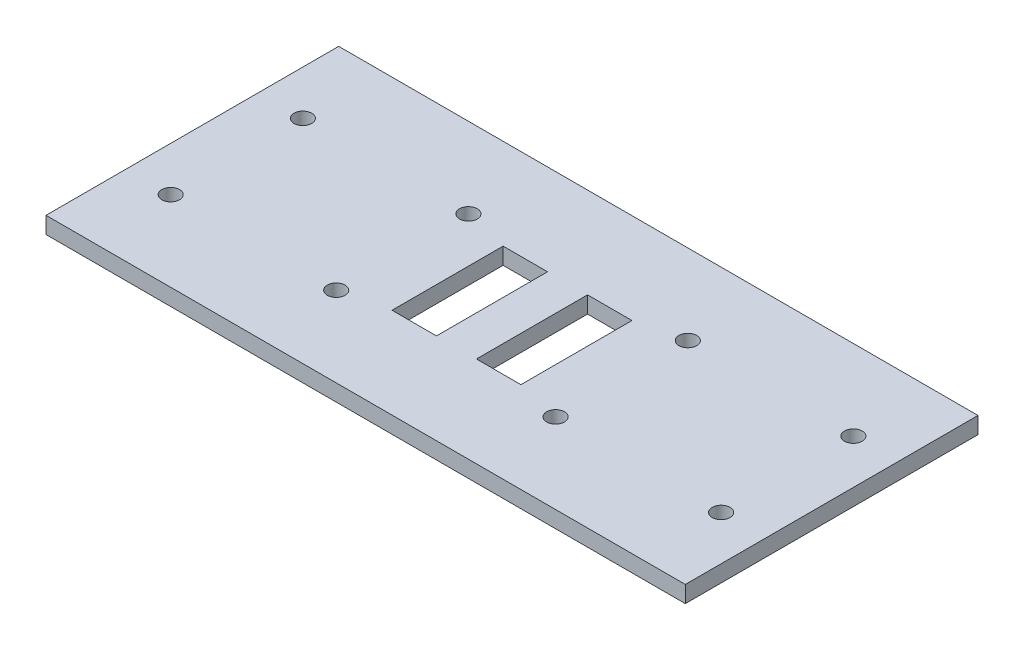
ISO-10303-21;
HEADER;
FILE_DESCRIPTION(('STEP AP214'),'2;1');
FILE_NAME('part.step','',(''),(''),'','','');
FILE_SCHEMA(('AUTOMOTIVE_DESIGN { 1 0 10303 214 1 1 1 1 }'));
ENDSEC;
DATA;
#1=APPLICATION_CONTEXT('core data for automotive mechanical design processes');
#2=APPLICATION_PROTOCOL_DEFINITION('international standard','automotive_design',2000,#1);
#3=PRODUCT_CONTEXT('',#1,'mechanical');
#4=PRODUCT('Part','Part','',(#3));
#5=PRODUCT_RELATED_PRODUCT_CATEGORY('part','',(#4));
#6=PRODUCT_DEFINITION_FORMATION('','',#4);
#7=PRODUCT_DEFINITION_CONTEXT('part definition',#1,'design');
#8=PRODUCT_DEFINITION('design','',#6,#7);
#9=PRODUCT_DEFINITION_SHAPE('','',#8);
#10=(LENGTH_UNIT() NAMED_UNIT(*) SI_UNIT(.MILLI.,.METRE.));
#11=(NAMED_UNIT(*) PLANE_ANGLE_UNIT() SI_UNIT($,.RADIAN.));
#12=(NAMED_UNIT(*) SI_UNIT($,.STERADIAN.) SOLID_ANGLE_UNIT());
#13=UNCERTAINTY_MEASURE_WITH_UNIT(LENGTH_MEASURE(1.E-05),#10,'distance_accuracy_value','');
#14=(GEOMETRIC_REPRESENTATION_CONTEXT(3) GLOBAL_UNCERTAINTY_ASSIGNED_CONTEXT((#13)) GLOBAL_UNIT_ASSIGNED_CONTEXT((#10,
#11,#12)) REPRESENTATION_CONTEXT('',''));
#15=CARTESIAN_POINT('',(0.,0.,0.));
#16=DIRECTION('',(0.,0.,1.));
#17=DIRECTION('',(1.,0.,0.));
#18=AXIS2_PLACEMENT_3D('',#15,#16,#17);
#19=CARTESIAN_POINT('',(-57.5483884452991,3.,26.3463557030392));
#20=DIRECTION('',(1.,0.,0.));
#21=DIRECTION('',(0.,0.,-1.));
#22=AXIS2_PLACEMENT_3D('',#19,#20,#21);
#23=PLANE('',#22);
#24=DIRECTION('',(0.,0.,1.));
#25=VECTOR('',#24,1.);
#26=CARTESIAN_POINT('',(-57.5483884452991,0.,26.3463557030392));
#27=LINE('',#26,#25);
#28=CARTESIAN_POINT('',(-57.5483884452991,0.,-26.3463557030392));
#29=VERTEX_POINT('',#28);
#30=CARTESIAN_POINT('',(-57.5483884452991,0.,26.3463557030392));
#31=VERTEX_POINT('',#30);
#32=EDGE_CURVE('E282',#29,#31,#27,.T.);
#33=ORIENTED_EDGE('',*,*,#32,.T.);
#34=DIRECTION('',(0.,-1.,0.));
#35=VECTOR('',#34,1.);
#36=CARTESIAN_POINT('',(-57.5483884452991,3.,26.3463557030392));
#37=LINE('',#36,#35);
#38=CARTESIAN_POINT('',(-57.5483884452991,3.,26.3463557030392));
#39=VERTEX_POINT('',#38);
#40=EDGE_CURVE('E11',#39,#31,#37,.T.);
#41=ORIENTED_EDGE('',*,*,#40,.F.);
#42=DIRECTION('',(0.,0.,1.));
#43=VECTOR('',#42,1.);
#44=CARTESIAN_POINT('',(-57.5483884452991,3.,26.3463557030392));
#45=LINE('',#44,#43);
#46=CARTESIAN_POINT('',(-57.5483884452991,3.,-26.3463557030392));
#47=VERTEX_POINT('',#46);
#48=EDGE_CURVE('E286',#47,#39,#45,.T.);
#49=ORIENTED_EDGE('',*,*,#48,.F.);
#50=DIRECTION('',(0.,-1.,0.));
#51=VECTOR('',#50,1.);
#52=CARTESIAN_POINT('',(-57.5483884452991,3.,-26.3463557030392));
#53=LINE('',#52,#51);
#54=EDGE_CURVE('E300',#47,#29,#53,.T.);
#55=ORIENTED_EDGE('',*,*,#54,.T.);
#56=EDGE_LOOP('',(#33,#41,#49,#55));
#57=FACE_BOUND('',#56,.T.);
#58=ADVANCED_FACE('F39',(#57),#23,.F.);
#59=CARTESIAN_POINT('',(57.5483884452991,3.,26.3463557030392));
#60=DIRECTION('',(0.,0.,-1.));
#61=DIRECTION('',(-1.,0.,0.));
#62=AXIS2_PLACEMENT_3D('',#59,#60,#61);
#63=PLANE('',#62);
#64=DIRECTION('',(1.,0.,0.));
#65=VECTOR('',#64,1.);
#66=CARTESIAN_POINT('',(57.5483884452991,0.,26.3463557030392));
#67=LINE('',#66,#65);
#68=CARTESIAN_POINT('',(57.5483884452991,0.,26.3463557030392));
#69=VERTEX_POINT('',#68);
#70=EDGE_CURVE('E304',#31,#69,#67,.T.);
#71=ORIENTED_EDGE('',*,*,#70,.T.);
#72=DIRECTION('',(0.,-1.,0.));
#73=VECTOR('',#72,1.);
#74=CARTESIAN_POINT('',(57.5483884452991,3.,26.3463557030392));
#75=LINE('',#74,#73);
#76=CARTESIAN_POINT('',(57.5483884452991,3.,26.3463557030392));
#77=VERTEX_POINT('',#76);
#78=EDGE_CURVE('E47',#77,#69,#75,.T.);
#79=ORIENTED_EDGE('',*,*,#78,.F.);
#80=DIRECTION('',(1.,0.,0.));
#81=VECTOR('',#80,1.);
#82=CARTESIAN_POINT('',(57.5483884452991,3.,26.3463557030392));
#83=LINE('',#82,#81);
#84=EDGE_CURVE('E290',#39,#77,#83,.T.);
#85=ORIENTED_EDGE('',*,*,#84,.F.);
#86=ORIENTED_EDGE('',*,*,#40,.T.);
#87=EDGE_LOOP('',(#71,#79,#85,#86));
#88=FACE_BOUND('',#87,.T.);
#89=ADVANCED_FACE('F339',(#88),#63,.F.);
#90=CARTESIAN_POINT('',(57.5483884452991,3.,-26.3463557030392));
#91=DIRECTION('',(-1.,0.,0.));
#92=DIRECTION('',(0.,0.,1.));
#93=AXIS2_PLACEMENT_3D('',#90,#91,#92);
#94=PLANE('',#93);
#95=DIRECTION('',(0.,0.,-1.));
#96=VECTOR('',#95,1.);
#97=CARTESIAN_POINT('',(57.5483884452991,0.,-26.3463557030392));
#98=LINE('',#97,#96);
#99=CARTESIAN_POINT('',(57.5483884452991,0.,-26.3463557030392));
#100=VERTEX_POINT('',#99);
#101=EDGE_CURVE('E307',#69,#100,#98,.T.);
#102=ORIENTED_EDGE('',*,*,#101,.T.);
#103=DIRECTION('',(0.,-1.,0.));
#104=VECTOR('',#103,1.);
#105=CARTESIAN_POINT('',(57.5483884452991,3.,-26.3463557030392));
#106=LINE('',#105,#104);
#107=CARTESIAN_POINT('',(57.5483884452991,3.,-26.3463557030392));
#108=VERTEX_POINT('',#107);
#109=EDGE_CURVE('E315',#108,#100,#106,.T.);
#110=ORIENTED_EDGE('',*,*,#109,.F.);
#111=DIRECTION('',(0.,0.,-1.));
#112=VECTOR('',#111,1.);
#113=CARTESIAN_POINT('',(57.5483884452991,3.,-26.3463557030392));
#114=LINE('',#113,#112);
#115=EDGE_CURVE('E294',#77,#108,#114,.T.);
#116=ORIENTED_EDGE('',*,*,#115,.F.);
#117=ORIENTED_EDGE('',*,*,#78,.T.);
#118=EDGE_LOOP('',(#102,#110,#116,#117));
#119=FACE_BOUND('',#118,.T.);
#120=ADVANCED_FACE('F324',(#119),#94,.F.);
#121=CARTESIAN_POINT('',(-57.5483884452991,3.,-26.3463557030392));
#122=DIRECTION('',(0.,0.,1.));
#123=DIRECTION('',(1.,0.,0.));
#124=AXIS2_PLACEMENT_3D('',#121,#122,#123);
#125=PLANE('',#124);
#126=DIRECTION('',(-1.,0.,0.));
#127=VECTOR('',#126,1.);
#128=CARTESIAN_POINT('',(-57.5483884452991,0.,-26.3463557030392));
#129=LINE('',#128,#127);
#130=EDGE_CURVE('E291',#100,#29,#129,.T.);
#131=ORIENTED_EDGE('',*,*,#130,.T.);
#132=ORIENTED_EDGE('',*,*,#54,.F.);
#133=DIRECTION('',(-1.,0.,0.));
#134=VECTOR('',#133,1.);
#135=CARTESIAN_POINT('',(-57.5483884452991,3.,-26.3463557030392));
#136=LINE('',#135,#134);
#137=EDGE_CURVE('E297',#108,#47,#136,.T.);
#138=ORIENTED_EDGE('',*,*,#137,.F.);
#139=ORIENTED_EDGE('',*,*,#109,.T.);
#140=EDGE_LOOP('',(#131,#132,#138,#139));
#141=FACE_BOUND('',#140,.T.);
#142=ADVANCED_FACE('F332',(#141),#125,.F.);
#143=CARTESIAN_POINT('',(0.,3.,0.));
#144=DIRECTION('',(0.,-1.,0.));
#145=DIRECTION('',(0.,0.,-1.));
#146=AXIS2_PLACEMENT_3D('',#143,#144,#145);
#147=PLANE('',#146);
#148=DIRECTION('',(1.,0.,0.));
#149=VECTOR('',#148,1.);
#150=CARTESIAN_POINT('',(-3.59838844529941,3.,9.9999999999997));
#151=LINE('',#150,#149);
#152=CARTESIAN_POINT('',(-11.5983884452994,3.,9.99999999999971));
#153=VERTEX_POINT('',#152);
#154=CARTESIAN_POINT('',(-3.59838844529941,3.,9.9999999999997));
#155=VERTEX_POINT('',#154);
#156=EDGE_CURVE('E165',#153,#155,#151,.T.);
#157=ORIENTED_EDGE('',*,*,#156,.F.);
#158=DIRECTION('',(0.,0.,1.));
#159=VECTOR('',#158,1.);
#160=CARTESIAN_POINT('',(-11.5983884452994,3.,9.99999999999971));
#161=LINE('',#160,#159);
#162=CARTESIAN_POINT('',(-11.5983884452994,3.,-10.0000000000003));
#163=VERTEX_POINT('',#162);
#164=EDGE_CURVE('E54',#163,#153,#161,.T.);
#165=ORIENTED_EDGE('',*,*,#164,.F.);
#166=DIRECTION('',(-1.,0.,0.));
#167=VECTOR('',#166,1.);
#168=CARTESIAN_POINT('',(-11.5983884452994,3.,-10.0000000000003));
#169=LINE('',#168,#167);
#170=CARTESIAN_POINT('',(-3.59838844529941,3.,-10.0000000000003));
#171=VERTEX_POINT('',#170);
#172=EDGE_CURVE('E152',#171,#163,#169,.T.);
#173=ORIENTED_EDGE('',*,*,#172,.F.);
#174=DIRECTION('',(0.,0.,-1.));
#175=VECTOR('',#174,1.);
#176=CARTESIAN_POINT('',(-3.59838844529941,3.,-10.0000000000003));
#177=LINE('',#176,#175);
#178=EDGE_CURVE('E156',#155,#171,#177,.T.);
#179=ORIENTED_EDGE('',*,*,#178,.F.);
#180=EDGE_LOOP('',(#157,#165,#173,#179));
#181=FACE_BOUND('',#180,.T.);
#182=DIRECTION('',(1.,0.,0.));
#183=VECTOR('',#182,1.);
#184=CARTESIAN_POINT('',(3.59838844529941,3.,9.9999999999997));
#185=LINE('',#184,#183);
#186=CARTESIAN_POINT('',(3.59838844529941,3.,9.9999999999997));
#187=VERTEX_POINT('',#186);
#188=CARTESIAN_POINT('',(11.5983884452994,3.,9.9999999999997));
#189=VERTEX_POINT('',#188);
#190=EDGE_CURVE('E201',#187,#189,#185,.T.);
#191=ORIENTED_EDGE('',*,*,#190,.F.);
#192=DIRECTION('',(0.,0.,1.));
#193=VECTOR('',#192,1.);
#194=CARTESIAN_POINT('',(3.5983884452994,3.,-10.0000000000003));
#195=LINE('',#194,#193);
#196=CARTESIAN_POINT('',(3.5983884452994,3.,-10.0000000000003));
#197=VERTEX_POINT('',#196);
#198=EDGE_CURVE('E62',#197,#187,#195,.T.);
#199=ORIENTED_EDGE('',*,*,#198,.F.);
#200=DIRECTION('',(-1.,0.,0.));
#201=VECTOR('',#200,1.);
#202=CARTESIAN_POINT('',(11.5983884452994,3.,-10.0000000000003));
#203=LINE('',#202,#201);
#204=CARTESIAN_POINT('',(11.5983884452994,3.,-10.0000000000003));
#205=VERTEX_POINT('',#204);
#206=EDGE_CURVE('E186',#205,#197,#203,.T.);
#207=ORIENTED_EDGE('',*,*,#206,.F.);
#208=DIRECTION('',(0.,0.,-1.));
#209=VECTOR('',#208,1.);
#210=CARTESIAN_POINT('',(11.5983884452994,3.,9.9999999999997));
#211=LINE('',#210,#209);
#212=EDGE_CURVE('E205',#189,#205,#211,.T.);
#213=ORIENTED_EDGE('',*,*,#212,.F.);
#214=EDGE_LOOP('',(#191,#199,#207,#213));
#215=FACE_BOUND('',#214,.T.);
#216=CARTESIAN_POINT('',(49.5483884452993,3.,11.8999999999995));
#217=DIRECTION('',(0.,1.,0.));
#218=DIRECTION('',(0.,0.,-1.));
#219=AXIS2_PLACEMENT_3D('',#216,#217,#218);
#220=CIRCLE('',#219,1.6);
#221=CARTESIAN_POINT('',(49.5483884452993,3.,10.2999999999995));
#222=VERTEX_POINT('',#221);
#223=EDGE_CURVE('E226',#222,#222,#220,.T.);
#224=ORIENTED_EDGE('',*,*,#223,.F.);
#225=EDGE_LOOP('',(#224));
#226=FACE_BOUND('',#225,.T.);
#227=CARTESIAN_POINT('',(-19.7483884452993,3.,11.8999999999998));
#228=DIRECTION('',(0.,1.,0.));
#229=DIRECTION('',(0.,0.,1.));
#230=AXIS2_PLACEMENT_3D('',#227,#228,#229);
#231=CIRCLE('',#230,1.6);
#232=CARTESIAN_POINT('',(-19.7483884452993,3.,13.4999999999998));
#233=VERTEX_POINT('',#232);
#234=EDGE_CURVE('E251',#233,#233,#231,.T.);
#235=ORIENTED_EDGE('',*,*,#234,.F.);
#236=EDGE_LOOP('',(#235));
#237=FACE_BOUND('',#236,.T.);
#238=CARTESIAN_POINT('',(-49.5483884452993,3.,11.8999999999995));
#239=DIRECTION('',(0.,1.,0.));
#240=DIRECTION('',(0.,0.,1.));
#241=AXIS2_PLACEMENT_3D('',#238,#239,#240);
#242=CIRCLE('',#241,1.6);
#243=CARTESIAN_POINT('',(-49.5483884452993,3.,13.4999999999995));
#244=VERTEX_POINT('',#243);
#245=EDGE_CURVE('E250',#244,#244,#242,.T.);
#246=ORIENTED_EDGE('',*,*,#245,.F.);
#247=EDGE_LOOP('',(#246));
#248=FACE_BOUND('',#247,.T.);
#249=CARTESIAN_POINT('',(-19.748388445299,3.,-11.9000000000002));
#250=DIRECTION('',(0.,1.,0.));
#251=DIRECTION('',(0.,0.,1.));
#252=AXIS2_PLACEMENT_3D('',#249,#250,#251);
#253=CIRCLE('',#252,1.6);
#254=CARTESIAN_POINT('',(-19.748388445299,3.,-10.3000000000002));
#255=VERTEX_POINT('',#254);
#256=EDGE_CURVE('E267',#255,#255,#253,.T.);
#257=ORIENTED_EDGE('',*,*,#256,.F.);
#258=EDGE_LOOP('',(#257));
#259=FACE_BOUND('',#258,.T.);
#260=CARTESIAN_POINT('',(19.7483884452993,3.,11.8999999999998));
#261=DIRECTION('',(0.,1.,0.));
#262=DIRECTION('',(0.,0.,-1.));
#263=AXIS2_PLACEMENT_3D('',#260,#261,#262);
#264=CIRCLE('',#263,1.6);
#265=CARTESIAN_POINT('',(19.7483884452993,3.,10.2999999999998));
#266=VERTEX_POINT('',#265);
#267=EDGE_CURVE('E227',#266,#266,#264,.T.);
#268=ORIENTED_EDGE('',*,*,#267,.F.);
#269=EDGE_LOOP('',(#268));
#270=FACE_BOUND('',#269,.T.);
#271=CARTESIAN_POINT('',(19.748388445299,3.,-11.9000000000002));
#272=DIRECTION('',(0.,1.,0.));
#273=DIRECTION('',(0.,0.,-1.));
#274=AXIS2_PLACEMENT_3D('',#271,#272,#273);
#275=CIRCLE('',#274,1.6);
#276=CARTESIAN_POINT('',(19.748388445299,3.,-13.5000000000002));
#277=VERTEX_POINT('',#276);
#278=EDGE_CURVE('E235',#277,#277,#275,.T.);
#279=ORIENTED_EDGE('',*,*,#278,.F.);
#280=EDGE_LOOP('',(#279));
#281=FACE_BOUND('',#280,.T.);
#282=CARTESIAN_POINT('',(49.548388445299,3.,-11.9000000000005));
#283=DIRECTION('',(0.,1.,0.));
#284=DIRECTION('',(0.,0.,-1.));
#285=AXIS2_PLACEMENT_3D('',#282,#283,#284);
#286=CIRCLE('',#285,1.6);
#287=CARTESIAN_POINT('',(49.548388445299,3.,-13.5000000000005));
#288=VERTEX_POINT('',#287);
#289=EDGE_CURVE('E175',#288,#288,#286,.T.);
#290=ORIENTED_EDGE('',*,*,#289,.F.);
#291=EDGE_LOOP('',(#290));
#292=FACE_BOUND('',#291,.T.);
#293=CARTESIAN_POINT('',(-49.548388445299,3.,-11.9000000000005));
#294=DIRECTION('',(0.,1.,0.));
#295=DIRECTION('',(0.,0.,1.));
#296=AXIS2_PLACEMENT_3D('',#293,#294,#295);
#297=CIRCLE('',#296,1.6);
#298=CARTESIAN_POINT('',(-49.548388445299,3.,-10.3000000000005));
#299=VERTEX_POINT('',#298);
#300=EDGE_CURVE('E266',#299,#299,#297,.T.);
#301=ORIENTED_EDGE('',*,*,#300,.F.);
#302=EDGE_LOOP('',(#301));
#303=FACE_BOUND('',#302,.T.);
#304=ORIENTED_EDGE('',*,*,#48,.T.);
#305=ORIENTED_EDGE('',*,*,#84,.T.);
#306=ORIENTED_EDGE('',*,*,#115,.T.);
#307=ORIENTED_EDGE('',*,*,#137,.T.);
#308=EDGE_LOOP('',(#304,#305,#306,#307));
#309=FACE_BOUND('',#308,.T.);
#310=ADVANCED_FACE('F338',(#181,#215,#226,#237,#248,#259,#270,#281,#292,#303,#309),#147,.F.);
#311=CARTESIAN_POINT('',(0.,0.,0.));
#312=DIRECTION('',(0.,-1.,0.));
#313=DIRECTION('',(0.,0.,-1.));
#314=AXIS2_PLACEMENT_3D('',#311,#312,#313);
#315=PLANE('',#314);
#316=DIRECTION('',(0.,0.,1.));
#317=VECTOR('',#316,1.);
#318=CARTESIAN_POINT('',(-11.5983884452994,0.,9.99999999999971));
#319=LINE('',#318,#317);
#320=CARTESIAN_POINT('',(-11.5983884452994,0.,-10.0000000000003));
#321=VERTEX_POINT('',#320);
#322=CARTESIAN_POINT('',(-11.5983884452994,0.,9.99999999999971));
#323=VERTEX_POINT('',#322);
#324=EDGE_CURVE('E130',#321,#323,#319,.T.);
#325=ORIENTED_EDGE('',*,*,#324,.T.);
#326=DIRECTION('',(1.,0.,0.));
#327=VECTOR('',#326,1.);
#328=CARTESIAN_POINT('',(-3.59838844529941,0.,9.9999999999997));
#329=LINE('',#328,#327);
#330=CARTESIAN_POINT('',(-3.59838844529941,0.,9.9999999999997));
#331=VERTEX_POINT('',#330);
#332=EDGE_CURVE('E141',#323,#331,#329,.T.);
#333=ORIENTED_EDGE('',*,*,#332,.T.);
#334=DIRECTION('',(0.,0.,-1.));
#335=VECTOR('',#334,1.);
#336=CARTESIAN_POINT('',(-3.59838844529941,0.,-10.0000000000003));
#337=LINE('',#336,#335);
#338=CARTESIAN_POINT('',(-3.59838844529941,0.,-10.0000000000003));
#339=VERTEX_POINT('',#338);
#340=EDGE_CURVE('E146',#331,#339,#337,.T.);
#341=ORIENTED_EDGE('',*,*,#340,.T.);
#342=DIRECTION('',(-1.,0.,0.));
#343=VECTOR('',#342,1.);
#344=CARTESIAN_POINT('',(-11.5983884452994,0.,-10.0000000000003));
#345=LINE('',#344,#343);
#346=EDGE_CURVE('E137',#339,#321,#345,.T.);
#347=ORIENTED_EDGE('',*,*,#346,.T.);
#348=EDGE_LOOP('',(#325,#333,#341,#347));
#349=FACE_BOUND('',#348,.T.);
#350=DIRECTION('',(0.,0.,1.));
#351=VECTOR('',#350,1.);
#352=CARTESIAN_POINT('',(3.5983884452994,0.,-10.0000000000003));
#353=LINE('',#352,#351);
#354=CARTESIAN_POINT('',(3.5983884452994,0.,-10.0000000000003));
#355=VERTEX_POINT('',#354);
#356=CARTESIAN_POINT('',(3.59838844529941,0.,9.9999999999997));
#357=VERTEX_POINT('',#356);
#358=EDGE_CURVE('E181',#355,#357,#353,.T.);
#359=ORIENTED_EDGE('',*,*,#358,.T.);
#360=DIRECTION('',(1.,0.,0.));
#361=VECTOR('',#360,1.);
#362=CARTESIAN_POINT('',(3.59838844529941,0.,9.9999999999997));
#363=LINE('',#362,#361);
#364=CARTESIAN_POINT('',(11.5983884452994,0.,9.9999999999997));
#365=VERTEX_POINT('',#364);
#366=EDGE_CURVE('E185',#357,#365,#363,.T.);
#367=ORIENTED_EDGE('',*,*,#366,.T.);
#368=DIRECTION('',(0.,0.,-1.));
#369=VECTOR('',#368,1.);
#370=CARTESIAN_POINT('',(11.5983884452994,0.,9.9999999999997));
#371=LINE('',#370,#369);
#372=CARTESIAN_POINT('',(11.5983884452994,0.,-10.0000000000003));
#373=VERTEX_POINT('',#372);
#374=EDGE_CURVE('E190',#365,#373,#371,.T.);
#375=ORIENTED_EDGE('',*,*,#374,.T.);
#376=DIRECTION('',(-1.,0.,0.));
#377=VECTOR('',#376,1.);
#378=CARTESIAN_POINT('',(11.5983884452994,0.,-10.0000000000003));
#379=LINE('',#378,#377);
#380=EDGE_CURVE('E194',#373,#355,#379,.T.);
#381=ORIENTED_EDGE('',*,*,#380,.T.);
#382=EDGE_LOOP('',(#359,#367,#375,#381));
#383=FACE_BOUND('',#382,.T.);
#384=CARTESIAN_POINT('',(49.5483884452993,0.,11.8999999999995));
#385=DIRECTION('',(0.,1.,0.));
#386=DIRECTION('',(0.,0.,-1.));
#387=AXIS2_PLACEMENT_3D('',#384,#385,#386);
#388=CIRCLE('',#387,1.6);
#389=CARTESIAN_POINT('',(49.5483884452993,0.,10.2999999999995));
#390=VERTEX_POINT('',#389);
#391=EDGE_CURVE('E255',#390,#390,#388,.T.);
#392=ORIENTED_EDGE('',*,*,#391,.T.);
#393=EDGE_LOOP('',(#392));
#394=FACE_BOUND('',#393,.T.);
#395=CARTESIAN_POINT('',(-19.7483884452993,0.,11.8999999999998));
#396=DIRECTION('',(0.,1.,0.));
#397=DIRECTION('',(0.,0.,1.));
#398=AXIS2_PLACEMENT_3D('',#395,#396,#397);
#399=CIRCLE('',#398,1.6);
#400=CARTESIAN_POINT('',(-19.7483884452993,0.,13.4999999999998));
#401=VERTEX_POINT('',#400);
#402=EDGE_CURVE('E246',#401,#401,#399,.T.);
#403=ORIENTED_EDGE('',*,*,#402,.T.);
#404=EDGE_LOOP('',(#403));
#405=FACE_BOUND('',#404,.T.);
#406=CARTESIAN_POINT('',(-49.5483884452993,0.,11.8999999999995));
#407=DIRECTION('',(0.,1.,0.));
#408=DIRECTION('',(0.,0.,1.));
#409=AXIS2_PLACEMENT_3D('',#406,#407,#408);
#410=CIRCLE('',#409,1.6);
#411=CARTESIAN_POINT('',(-49.5483884452993,0.,13.4999999999995));
#412=VERTEX_POINT('',#411);
#413=EDGE_CURVE('E271',#412,#412,#410,.T.);
#414=ORIENTED_EDGE('',*,*,#413,.T.);
#415=EDGE_LOOP('',(#414));
#416=FACE_BOUND('',#415,.T.);
#417=CARTESIAN_POINT('',(-19.748388445299,0.,-11.9000000000002));
#418=DIRECTION('',(0.,1.,0.));
#419=DIRECTION('',(0.,0.,1.));
#420=AXIS2_PLACEMENT_3D('',#417,#418,#419);
#421=CIRCLE('',#420,1.6);
#422=CARTESIAN_POINT('',(-19.748388445299,0.,-10.3000000000002));
#423=VERTEX_POINT('',#422);
#424=EDGE_CURVE('E262',#423,#423,#421,.T.);
#425=ORIENTED_EDGE('',*,*,#424,.T.);
#426=EDGE_LOOP('',(#425));
#427=FACE_BOUND('',#426,.T.);
#428=CARTESIAN_POINT('',(19.7483884452993,0.,11.8999999999998));
#429=DIRECTION('',(0.,1.,0.));
#430=DIRECTION('',(0.,0.,-1.));
#431=AXIS2_PLACEMENT_3D('',#428,#429,#430);
#432=CIRCLE('',#431,1.6);
#433=CARTESIAN_POINT('',(19.7483884452993,0.,10.2999999999998));
#434=VERTEX_POINT('',#433);
#435=EDGE_CURVE('E222',#434,#434,#432,.T.);
#436=ORIENTED_EDGE('',*,*,#435,.T.);
#437=EDGE_LOOP('',(#436));
#438=FACE_BOUND('',#437,.T.);
#439=CARTESIAN_POINT('',(19.748388445299,0.,-11.9000000000002));
#440=DIRECTION('',(0.,1.,0.));
#441=DIRECTION('',(0.,0.,-1.));
#442=AXIS2_PLACEMENT_3D('',#439,#440,#441);
#443=CIRCLE('',#442,1.6);
#444=CARTESIAN_POINT('',(19.748388445299,0.,-13.5000000000002));
#445=VERTEX_POINT('',#444);
#446=EDGE_CURVE('E231',#445,#445,#443,.T.);
#447=ORIENTED_EDGE('',*,*,#446,.T.);
#448=EDGE_LOOP('',(#447));
#449=FACE_BOUND('',#448,.T.);
#450=CARTESIAN_POINT('',(49.548388445299,0.,-11.9000000000005));
#451=DIRECTION('',(0.,1.,0.));
#452=DIRECTION('',(0.,0.,-1.));
#453=AXIS2_PLACEMENT_3D('',#450,#451,#452);
#454=CIRCLE('',#453,1.6);
#455=CARTESIAN_POINT('',(49.548388445299,0.,-13.5000000000005));
#456=VERTEX_POINT('',#455);
#457=EDGE_CURVE('E239',#456,#456,#454,.T.);
#458=ORIENTED_EDGE('',*,*,#457,.T.);
#459=EDGE_LOOP('',(#458));
#460=FACE_BOUND('',#459,.T.);
#461=CARTESIAN_POINT('',(-49.548388445299,0.,-11.9000000000005));
#462=DIRECTION('',(0.,1.,0.));
#463=DIRECTION('',(0.,0.,1.));
#464=AXIS2_PLACEMENT_3D('',#461,#462,#463);
#465=CIRCLE('',#464,1.6);
#466=CARTESIAN_POINT('',(-49.548388445299,0.,-10.3000000000005));
#467=VERTEX_POINT('',#466);
#468=EDGE_CURVE('E278',#467,#467,#465,.T.);
#469=ORIENTED_EDGE('',*,*,#468,.T.);
#470=EDGE_LOOP('',(#469));
#471=FACE_BOUND('',#470,.T.);
#472=ORIENTED_EDGE('',*,*,#32,.F.);
#473=ORIENTED_EDGE('',*,*,#130,.F.);
#474=ORIENTED_EDGE('',*,*,#101,.F.);
#475=ORIENTED_EDGE('',*,*,#70,.F.);
#476=EDGE_LOOP('',(#472,#473,#474,#475));
#477=FACE_BOUND('',#476,.T.);
#478=ADVANCED_FACE('F148',(#349,#383,#394,#405,#416,#427,#438,#449,#460,#471,#477),#315,.T.);
#479=CARTESIAN_POINT('',(-49.548388445299,0.,-11.9000000000005));
#480=DIRECTION('',(0.,1.,0.));
#481=DIRECTION('',(0.,0.,1.));
#482=AXIS2_PLACEMENT_3D('',#479,#480,#481);
#483=CYLINDRICAL_SURFACE('',#482,1.6);
#484=ORIENTED_EDGE('',*,*,#468,.F.);
#485=EDGE_LOOP('',(#484));
#486=FACE_BOUND('',#485,.T.);
#487=ORIENTED_EDGE('',*,*,#300,.T.);
#488=EDGE_LOOP('',(#487));
#489=FACE_BOUND('',#488,.T.);
#490=ADVANCED_FACE('F351',(#486,#489),#483,.F.);
#491=CARTESIAN_POINT('',(49.548388445299,0.,-11.9000000000005));
#492=DIRECTION('',(0.,1.,0.));
#493=DIRECTION('',(0.,0.,1.));
#494=AXIS2_PLACEMENT_3D('',#491,#492,#493);
#495=CYLINDRICAL_SURFACE('',#494,1.6);
#496=ORIENTED_EDGE('',*,*,#457,.F.);
#497=EDGE_LOOP('',(#496));
#498=FACE_BOUND('',#497,.T.);
#499=ORIENTED_EDGE('',*,*,#289,.T.);
#500=EDGE_LOOP('',(#499));
#501=FACE_BOUND('',#500,.T.);
#502=ADVANCED_FACE('F357',(#498,#501),#495,.F.);
#503=CARTESIAN_POINT('',(19.748388445299,0.,-11.9000000000002));
#504=DIRECTION('',(0.,1.,0.));
#505=DIRECTION('',(0.,0.,1.));
#506=AXIS2_PLACEMENT_3D('',#503,#504,#505);
#507=CYLINDRICAL_SURFACE('',#506,1.6);
#508=ORIENTED_EDGE('',*,*,#446,.F.);
#509=EDGE_LOOP('',(#508));
#510=FACE_BOUND('',#509,.T.);
#511=ORIENTED_EDGE('',*,*,#278,.T.);
#512=EDGE_LOOP('',(#511));
#513=FACE_BOUND('',#512,.T.);
#514=ADVANCED_FACE('F379',(#510,#513),#507,.F.);
#515=CARTESIAN_POINT('',(19.7483884452993,0.,11.8999999999998));
#516=DIRECTION('',(0.,1.,0.));
#517=DIRECTION('',(0.,0.,1.));
#518=AXIS2_PLACEMENT_3D('',#515,#516,#517);
#519=CYLINDRICAL_SURFACE('',#518,1.6);
#520=ORIENTED_EDGE('',*,*,#435,.F.);
#521=EDGE_LOOP('',(#520));
#522=FACE_BOUND('',#521,.T.);
#523=ORIENTED_EDGE('',*,*,#267,.T.);
#524=EDGE_LOOP('',(#523));
#525=FACE_BOUND('',#524,.T.);
#526=ADVANCED_FACE('F367',(#522,#525),#519,.F.);
#527=CARTESIAN_POINT('',(-19.748388445299,0.,-11.9000000000002));
#528=DIRECTION('',(0.,1.,0.));
#529=DIRECTION('',(0.,0.,1.));
#530=AXIS2_PLACEMENT_3D('',#527,#528,#529);
#531=CYLINDRICAL_SURFACE('',#530,1.6);
#532=ORIENTED_EDGE('',*,*,#424,.F.);
#533=EDGE_LOOP('',(#532));
#534=FACE_BOUND('',#533,.T.);
#535=ORIENTED_EDGE('',*,*,#256,.T.);
#536=EDGE_LOOP('',(#535));
#537=FACE_BOUND('',#536,.T.);
#538=ADVANCED_FACE('F363',(#534,#537),#531,.F.);
#539=CARTESIAN_POINT('',(-49.5483884452993,0.,11.8999999999995));
#540=DIRECTION('',(0.,1.,0.));
#541=DIRECTION('',(0.,0.,1.));
#542=AXIS2_PLACEMENT_3D('',#539,#540,#541);
#543=CYLINDRICAL_SURFACE('',#542,1.6);
#544=ORIENTED_EDGE('',*,*,#413,.F.);
#545=EDGE_LOOP('',(#544));
#546=FACE_BOUND('',#545,.T.);
#547=ORIENTED_EDGE('',*,*,#245,.T.);
#548=EDGE_LOOP('',(#547));
#549=FACE_BOUND('',#548,.T.);
#550=ADVANCED_FACE('F359',(#546,#549),#543,.F.);
#551=CARTESIAN_POINT('',(-19.7483884452993,0.,11.8999999999998));
#552=DIRECTION('',(0.,1.,0.));
#553=DIRECTION('',(0.,0.,1.));
#554=AXIS2_PLACEMENT_3D('',#551,#552,#553);
#555=CYLINDRICAL_SURFACE('',#554,1.6);
#556=ORIENTED_EDGE('',*,*,#402,.F.);
#557=EDGE_LOOP('',(#556));
#558=FACE_BOUND('',#557,.T.);
#559=ORIENTED_EDGE('',*,*,#234,.T.);
#560=EDGE_LOOP('',(#559));
#561=FACE_BOUND('',#560,.T.);
#562=ADVANCED_FACE('F362',(#558,#561),#555,.F.);
#563=CARTESIAN_POINT('',(49.5483884452993,0.,11.8999999999995));
#564=DIRECTION('',(0.,1.,0.));
#565=DIRECTION('',(0.,0.,1.));
#566=AXIS2_PLACEMENT_3D('',#563,#564,#565);
#567=CYLINDRICAL_SURFACE('',#566,1.6);
#568=ORIENTED_EDGE('',*,*,#391,.F.);
#569=EDGE_LOOP('',(#568));
#570=FACE_BOUND('',#569,.T.);
#571=ORIENTED_EDGE('',*,*,#223,.T.);
#572=EDGE_LOOP('',(#571));
#573=FACE_BOUND('',#572,.T.);
#574=ADVANCED_FACE('F369',(#570,#573),#567,.F.);
#575=CARTESIAN_POINT('',(3.5983884452994,0.,-10.0000000000003));
#576=DIRECTION('',(-1.,0.,0.));
#577=DIRECTION('',(0.,0.,1.));
#578=AXIS2_PLACEMENT_3D('',#575,#576,#577);
#579=PLANE('',#578);
#580=ORIENTED_EDGE('',*,*,#198,.T.);
#581=DIRECTION('',(0.,1.,0.));
#582=VECTOR('',#581,1.);
#583=CARTESIAN_POINT('',(3.59838844529941,0.,9.9999999999997));
#584=LINE('',#583,#582);
#585=EDGE_CURVE('E198',#357,#187,#584,.T.);
#586=ORIENTED_EDGE('',*,*,#585,.F.);
#587=ORIENTED_EDGE('',*,*,#358,.F.);
#588=DIRECTION('',(0.,1.,0.));
#589=VECTOR('',#588,1.);
#590=CARTESIAN_POINT('',(3.5983884452994,0.,-10.0000000000003));
#591=LINE('',#590,#589);
#592=EDGE_CURVE('E166',#355,#197,#591,.T.);
#593=ORIENTED_EDGE('',*,*,#592,.T.);
#594=EDGE_LOOP('',(#580,#586,#587,#593));
#595=FACE_BOUND('',#594,.T.);
#596=ADVANCED_FACE('F372',(#595),#579,.F.);
#597=CARTESIAN_POINT('',(11.5983884452994,0.,-10.0000000000003));
#598=DIRECTION('',(0.,0.,-1.));
#599=DIRECTION('',(-1.,0.,0.));
#600=AXIS2_PLACEMENT_3D('',#597,#598,#599);
#601=PLANE('',#600);
#602=ORIENTED_EDGE('',*,*,#206,.T.);
#603=ORIENTED_EDGE('',*,*,#592,.F.);
#604=ORIENTED_EDGE('',*,*,#380,.F.);
#605=DIRECTION('',(0.,1.,0.));
#606=VECTOR('',#605,1.);
#607=CARTESIAN_POINT('',(11.5983884452994,0.,-10.0000000000003));
#608=LINE('',#607,#606);
#609=EDGE_CURVE('E214',#373,#205,#608,.T.);
#610=ORIENTED_EDGE('',*,*,#609,.T.);
#611=EDGE_LOOP('',(#602,#603,#604,#610));
#612=FACE_BOUND('',#611,.T.);
#613=ADVANCED_FACE('F389',(#612),#601,.F.);
#614=CARTESIAN_POINT('',(11.5983884452994,0.,9.9999999999997));
#615=DIRECTION('',(1.,0.,0.));
#616=DIRECTION('',(0.,0.,-1.));
#617=AXIS2_PLACEMENT_3D('',#614,#615,#616);
#618=PLANE('',#617);
#619=ORIENTED_EDGE('',*,*,#212,.T.);
#620=ORIENTED_EDGE('',*,*,#609,.F.);
#621=ORIENTED_EDGE('',*,*,#374,.F.);
#622=DIRECTION('',(0.,1.,0.));
#623=VECTOR('',#622,1.);
#624=CARTESIAN_POINT('',(11.5983884452994,0.,9.9999999999997));
#625=LINE('',#624,#623);
#626=EDGE_CURVE('E217',#365,#189,#625,.T.);
#627=ORIENTED_EDGE('',*,*,#626,.T.);
#628=EDGE_LOOP('',(#619,#620,#621,#627));
#629=FACE_BOUND('',#628,.T.);
#630=ADVANCED_FACE('F393',(#629),#618,.F.);
#631=CARTESIAN_POINT('',(3.59838844529941,0.,9.9999999999997));
#632=DIRECTION('',(0.,0.,1.));
#633=DIRECTION('',(1.,0.,0.));
#634=AXIS2_PLACEMENT_3D('',#631,#632,#633);
#635=PLANE('',#634);
#636=ORIENTED_EDGE('',*,*,#190,.T.);
#637=ORIENTED_EDGE('',*,*,#626,.F.);
#638=ORIENTED_EDGE('',*,*,#366,.F.);
#639=ORIENTED_EDGE('',*,*,#585,.T.);
#640=EDGE_LOOP('',(#636,#637,#638,#639));
#641=FACE_BOUND('',#640,.T.);
#642=ADVANCED_FACE('F390',(#641),#635,.F.);
#643=CARTESIAN_POINT('',(-11.5983884452994,0.,9.99999999999971));
#644=DIRECTION('',(-1.,0.,0.));
#645=DIRECTION('',(0.,0.,1.));
#646=AXIS2_PLACEMENT_3D('',#643,#644,#645);
#647=PLANE('',#646);
#648=ORIENTED_EDGE('',*,*,#164,.T.);
#649=DIRECTION('',(0.,1.,0.));
#650=VECTOR('',#649,1.);
#651=CARTESIAN_POINT('',(-11.5983884452994,0.,9.99999999999971));
#652=LINE('',#651,#650);
#653=EDGE_CURVE('E126',#323,#153,#652,.T.);
#654=ORIENTED_EDGE('',*,*,#653,.F.);
#655=ORIENTED_EDGE('',*,*,#324,.F.);
#656=DIRECTION('',(0.,1.,0.));
#657=VECTOR('',#656,1.);
#658=CARTESIAN_POINT('',(-11.5983884452994,0.,-10.0000000000003));
#659=LINE('',#658,#657);
#660=EDGE_CURVE('E172',#321,#163,#659,.T.);
#661=ORIENTED_EDGE('',*,*,#660,.T.);
#662=EDGE_LOOP('',(#648,#654,#655,#661));
#663=FACE_BOUND('',#662,.T.);
#664=ADVANCED_FACE('F128',(#663),#647,.F.);
#665=CARTESIAN_POINT('',(-11.5983884452994,0.,-10.0000000000003));
#666=DIRECTION('',(0.,0.,-1.));
#667=DIRECTION('',(-1.,0.,0.));
#668=AXIS2_PLACEMENT_3D('',#665,#666,#667);
#669=PLANE('',#668);
#670=ORIENTED_EDGE('',*,*,#172,.T.);
#671=ORIENTED_EDGE('',*,*,#660,.F.);
#672=ORIENTED_EDGE('',*,*,#346,.F.);
#673=DIRECTION('',(0.,1.,0.));
#674=VECTOR('',#673,1.);
#675=CARTESIAN_POINT('',(-3.59838844529941,0.,-10.0000000000003));
#676=LINE('',#675,#674);
#677=EDGE_CURVE('E176',#339,#171,#676,.T.);
#678=ORIENTED_EDGE('',*,*,#677,.T.);
#679=EDGE_LOOP('',(#670,#671,#672,#678));
#680=FACE_BOUND('',#679,.T.);
#681=ADVANCED_FACE('F403',(#680),#669,.F.);
#682=CARTESIAN_POINT('',(-3.59838844529941,0.,-10.0000000000003));
#683=DIRECTION('',(1.,0.,0.));
#684=DIRECTION('',(0.,0.,-1.));
#685=AXIS2_PLACEMENT_3D('',#682,#683,#684);
#686=PLANE('',#685);
#687=ORIENTED_EDGE('',*,*,#178,.T.);
#688=ORIENTED_EDGE('',*,*,#677,.F.);
#689=ORIENTED_EDGE('',*,*,#340,.F.);
#690=DIRECTION('',(0.,1.,0.));
#691=VECTOR('',#690,1.);
#692=CARTESIAN_POINT('',(-3.59838844529941,0.,9.9999999999997));
#693=LINE('',#692,#691);
#694=EDGE_CURVE('E136',#331,#155,#693,.T.);
#695=ORIENTED_EDGE('',*,*,#694,.T.);
#696=EDGE_LOOP('',(#687,#688,#689,#695));
#697=FACE_BOUND('',#696,.T.);
#698=ADVANCED_FACE('F406',(#697),#686,.F.);
#699=CARTESIAN_POINT('',(-3.59838844529941,0.,9.9999999999997));
#700=DIRECTION('',(0.,0.,1.));
#701=DIRECTION('',(1.,0.,0.));
#702=AXIS2_PLACEMENT_3D('',#699,#700,#701);
#703=PLANE('',#702);
#704=ORIENTED_EDGE('',*,*,#156,.T.);
#705=ORIENTED_EDGE('',*,*,#694,.F.);
#706=ORIENTED_EDGE('',*,*,#332,.F.);
#707=ORIENTED_EDGE('',*,*,#653,.T.);
#708=EDGE_LOOP('',(#704,#705,#706,#707));
#709=FACE_BOUND('',#708,.T.);
#710=ADVANCED_FACE('F142',(#709),#703,.F.);
#711=CLOSED_SHELL('',(#58,#89,#120,#142,#310,#478,#490,#502,#514,#526,#538,#550,#562,#574,#596,
#613,#630,#642,#664,#681,#698,#710));
#712=MANIFOLD_SOLID_BREP('B2',#711);
#713=ADVANCED_BREP_SHAPE_REPRESENTATION('',(#18,#712),#14);
#714=SHAPE_DEFINITION_REPRESENTATION(#9,#713);
ENDSEC;
END-ISO-10303-21;
